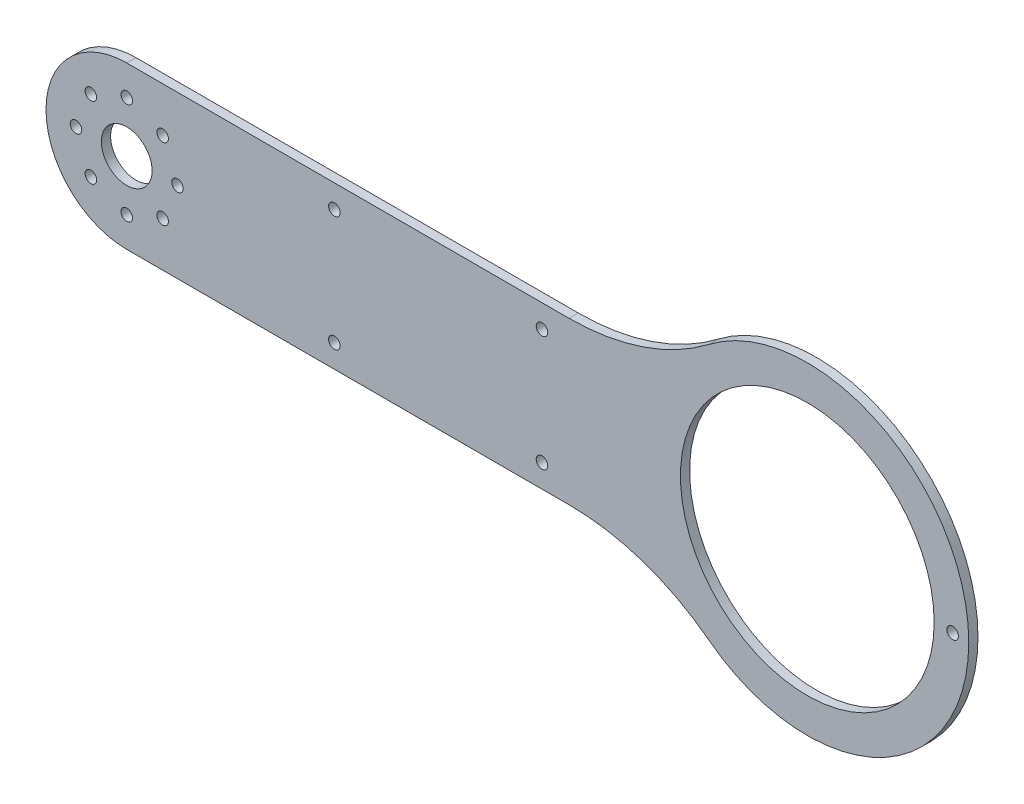
ISO-10303-21;
HEADER;
FILE_DESCRIPTION(('STEP AP214'),'2;1');
FILE_NAME('part.step','',(''),(''),'','','');
FILE_SCHEMA(('AUTOMOTIVE_DESIGN { 1 0 10303 214 1 1 1 1 }'));
ENDSEC;
DATA;
#1=APPLICATION_CONTEXT('core data for automotive mechanical design processes');
#2=APPLICATION_PROTOCOL_DEFINITION('international standard','automotive_design',2000,#1);
#3=PRODUCT_CONTEXT('',#1,'mechanical');
#4=PRODUCT('Part','Part','',(#3));
#5=PRODUCT_RELATED_PRODUCT_CATEGORY('part','',(#4));
#6=PRODUCT_DEFINITION_FORMATION('','',#4);
#7=PRODUCT_DEFINITION_CONTEXT('part definition',#1,'design');
#8=PRODUCT_DEFINITION('design','',#6,#7);
#9=PRODUCT_DEFINITION_SHAPE('','',#8);
#10=(LENGTH_UNIT() NAMED_UNIT(*) SI_UNIT(.MILLI.,.METRE.));
#11=(NAMED_UNIT(*) PLANE_ANGLE_UNIT() SI_UNIT($,.RADIAN.));
#12=(NAMED_UNIT(*) SI_UNIT($,.STERADIAN.) SOLID_ANGLE_UNIT());
#13=UNCERTAINTY_MEASURE_WITH_UNIT(LENGTH_MEASURE(1.E-05),#10,'distance_accuracy_value','');
#14=(GEOMETRIC_REPRESENTATION_CONTEXT(3) GLOBAL_UNCERTAINTY_ASSIGNED_CONTEXT((#13)) GLOBAL_UNIT_ASSIGNED_CONTEXT((#10,
#11,#12)) REPRESENTATION_CONTEXT('',''));
#15=CARTESIAN_POINT('',(0.,0.,0.));
#16=DIRECTION('',(0.,0.,1.));
#17=DIRECTION('',(1.,0.,0.));
#18=AXIS2_PLACEMENT_3D('',#15,#16,#17);
#19=CARTESIAN_POINT('',(-165.,-17.5,2.));
#20=DIRECTION('',(0.,1.,0.));
#21=DIRECTION('',(1.,0.,0.));
#22=AXIS2_PLACEMENT_3D('',#19,#20,#21);
#23=PLANE('',#22);
#24=DIRECTION('',(0.,0.,1.));
#25=VECTOR('',#24,1.);
#26=CARTESIAN_POINT('',(-147.5,-17.5,2.));
#27=LINE('',#26,#25);
#28=CARTESIAN_POINT('',(-147.5,-17.5,0.));
#29=VERTEX_POINT('',#28);
#30=CARTESIAN_POINT('',(-147.5,-17.5,2.));
#31=VERTEX_POINT('',#30);
#32=EDGE_CURVE('E11',#29,#31,#27,.T.);
#33=ORIENTED_EDGE('',*,*,#32,.F.);
#34=DIRECTION('',(-1.,0.,0.));
#35=VECTOR('',#34,1.);
#36=CARTESIAN_POINT('',(-51.6599457994296,-17.5,0.));
#37=LINE('',#36,#35);
#38=CARTESIAN_POINT('',(-51.6599457994295,-17.5,0.));
#39=VERTEX_POINT('',#38);
#40=EDGE_CURVE('E108',#29,#39,#37,.F.);
#41=ORIENTED_EDGE('',*,*,#40,.T.);
#42=DIRECTION('',(0.,0.,1.));
#43=VECTOR('',#42,1.);
#44=CARTESIAN_POINT('',(-51.6599457994295,-17.5,2.));
#45=LINE('',#44,#43);
#46=CARTESIAN_POINT('',(-51.6599457994295,-17.5,2.));
#47=VERTEX_POINT('',#46);
#48=EDGE_CURVE('E51',#39,#47,#45,.T.);
#49=ORIENTED_EDGE('',*,*,#48,.T.);
#50=DIRECTION('',(1.,0.,0.));
#51=VECTOR('',#50,1.);
#52=CARTESIAN_POINT('',(-165.,-17.5,2.));
#53=LINE('',#52,#51);
#54=EDGE_CURVE('E213',#31,#47,#53,.T.);
#55=ORIENTED_EDGE('',*,*,#54,.F.);
#56=EDGE_LOOP('',(#33,#41,#49,#55));
#57=FACE_BOUND('',#56,.T.);
#58=ADVANCED_FACE('F40',(#57),#23,.F.);
#59=CARTESIAN_POINT('',(-51.6599457994295,-67.5,2.));
#60=DIRECTION('',(0.,0.,-1.));
#61=DIRECTION('',(-1.,0.,0.));
#62=AXIS2_PLACEMENT_3D('',#59,#60,#61);
#63=CYLINDRICAL_SURFACE('',#62,50.);
#64=ORIENTED_EDGE('',*,*,#48,.F.);
#65=CARTESIAN_POINT('',(-51.6599457994295,-67.5,0.));
#66=DIRECTION('',(0.,0.,-1.));
#67=DIRECTION('',(-1.,0.,0.));
#68=AXIS2_PLACEMENT_3D('',#65,#66,#67);
#69=CIRCLE('',#68,50.);
#70=CARTESIAN_POINT('',(-21.2717423880004,-27.7941176470588,0.));
#71=VERTEX_POINT('',#70);
#72=EDGE_CURVE('E129',#39,#71,#69,.T.);
#73=ORIENTED_EDGE('',*,*,#72,.T.);
#74=DIRECTION('',(0.,0.,1.));
#75=VECTOR('',#74,1.);
#76=CARTESIAN_POINT('',(-21.2717423880004,-27.7941176470588,2.));
#77=LINE('',#76,#75);
#78=CARTESIAN_POINT('',(-21.2717423880004,-27.7941176470588,2.));
#79=VERTEX_POINT('',#78);
#80=EDGE_CURVE('E204',#71,#79,#77,.T.);
#81=ORIENTED_EDGE('',*,*,#80,.T.);
#82=CARTESIAN_POINT('',(-51.6599457994295,-67.5,2.));
#83=DIRECTION('',(0.,0.,-1.));
#84=DIRECTION('',(-1.,0.,0.));
#85=AXIS2_PLACEMENT_3D('',#82,#83,#84);
#86=CIRCLE('',#85,50.);
#87=EDGE_CURVE('E223',#47,#79,#86,.T.);
#88=ORIENTED_EDGE('',*,*,#87,.F.);
#89=EDGE_LOOP('',(#64,#73,#81,#88));
#90=FACE_BOUND('',#89,.T.);
#91=ADVANCED_FACE('F227',(#90),#63,.F.);
#92=CARTESIAN_POINT('',(0.,0.,2.));
#93=DIRECTION('',(0.,0.,-1.));
#94=DIRECTION('',(-1.,0.,0.));
#95=AXIS2_PLACEMENT_3D('',#92,#93,#94);
#96=CYLINDRICAL_SURFACE('',#95,35.);
#97=ORIENTED_EDGE('',*,*,#80,.F.);
#98=CARTESIAN_POINT('',(0.,0.,0.));
#99=DIRECTION('',(0.,0.,1.));
#100=DIRECTION('',(1.,0.,0.));
#101=AXIS2_PLACEMENT_3D('',#98,#99,#100);
#102=CIRCLE('',#101,35.);
#103=CARTESIAN_POINT('',(-21.2717423880004,27.7941176470588,0.));
#104=VERTEX_POINT('',#103);
#105=EDGE_CURVE('E125',#71,#104,#102,.T.);
#106=ORIENTED_EDGE('',*,*,#105,.T.);
#107=DIRECTION('',(0.,0.,1.));
#108=VECTOR('',#107,1.);
#109=CARTESIAN_POINT('',(-21.2717423880004,27.7941176470588,2.));
#110=LINE('',#109,#108);
#111=CARTESIAN_POINT('',(-21.2717423880004,27.7941176470588,2.));
#112=VERTEX_POINT('',#111);
#113=EDGE_CURVE('E200',#104,#112,#110,.T.);
#114=ORIENTED_EDGE('',*,*,#113,.T.);
#115=CARTESIAN_POINT('',(0.,0.,2.));
#116=DIRECTION('',(0.,0.,1.));
#117=DIRECTION('',(1.,0.,0.));
#118=AXIS2_PLACEMENT_3D('',#115,#116,#117);
#119=CIRCLE('',#118,35.);
#120=EDGE_CURVE('E229',#79,#112,#119,.T.);
#121=ORIENTED_EDGE('',*,*,#120,.F.);
#122=EDGE_LOOP('',(#97,#106,#114,#121));
#123=FACE_BOUND('',#122,.T.);
#124=ADVANCED_FACE('F318',(#123),#96,.T.);
#125=CARTESIAN_POINT('',(-51.6599457994296,67.5,2.));
#126=DIRECTION('',(0.,0.,-1.));
#127=DIRECTION('',(-1.,0.,0.));
#128=AXIS2_PLACEMENT_3D('',#125,#126,#127);
#129=CYLINDRICAL_SURFACE('',#128,50.);
#130=ORIENTED_EDGE('',*,*,#113,.F.);
#131=CARTESIAN_POINT('',(-51.6599457994296,67.5,0.));
#132=DIRECTION('',(0.,0.,-1.));
#133=DIRECTION('',(-1.,0.,0.));
#134=AXIS2_PLACEMENT_3D('',#131,#132,#133);
#135=CIRCLE('',#134,50.);
#136=CARTESIAN_POINT('',(-51.6599457994296,17.5,0.));
#137=VERTEX_POINT('',#136);
#138=EDGE_CURVE('E121',#104,#137,#135,.T.);
#139=ORIENTED_EDGE('',*,*,#138,.T.);
#140=DIRECTION('',(0.,0.,1.));
#141=VECTOR('',#140,1.);
#142=CARTESIAN_POINT('',(-51.6599457994296,17.5,2.));
#143=LINE('',#142,#141);
#144=CARTESIAN_POINT('',(-51.6599457994296,17.5,2.));
#145=VERTEX_POINT('',#144);
#146=EDGE_CURVE('E197',#137,#145,#143,.T.);
#147=ORIENTED_EDGE('',*,*,#146,.T.);
#148=CARTESIAN_POINT('',(-51.6599457994296,67.5,2.));
#149=DIRECTION('',(0.,0.,-1.));
#150=DIRECTION('',(-1.,0.,0.));
#151=AXIS2_PLACEMENT_3D('',#148,#149,#150);
#152=CIRCLE('',#151,50.);
#153=EDGE_CURVE('E232',#112,#145,#152,.T.);
#154=ORIENTED_EDGE('',*,*,#153,.F.);
#155=EDGE_LOOP('',(#130,#139,#147,#154));
#156=FACE_BOUND('',#155,.T.);
#157=ADVANCED_FACE('F426',(#156),#129,.F.);
#158=CARTESIAN_POINT('',(-165.,17.5,2.));
#159=DIRECTION('',(0.,-1.,0.));
#160=DIRECTION('',(-1.,0.,0.));
#161=AXIS2_PLACEMENT_3D('',#158,#159,#160);
#162=PLANE('',#161);
#163=ORIENTED_EDGE('',*,*,#146,.F.);
#164=DIRECTION('',(-1.,0.,0.));
#165=VECTOR('',#164,1.);
#166=CARTESIAN_POINT('',(-51.6599457994296,17.5,0.));
#167=LINE('',#166,#165);
#168=CARTESIAN_POINT('',(-147.5,17.5,0.));
#169=VERTEX_POINT('',#168);
#170=EDGE_CURVE('E117',#137,#169,#167,.T.);
#171=ORIENTED_EDGE('',*,*,#170,.T.);
#172=DIRECTION('',(0.,0.,1.));
#173=VECTOR('',#172,1.);
#174=CARTESIAN_POINT('',(-147.5,17.5,2.));
#175=LINE('',#174,#173);
#176=CARTESIAN_POINT('',(-147.5,17.5,2.));
#177=VERTEX_POINT('',#176);
#178=EDGE_CURVE('E59',#169,#177,#175,.T.);
#179=ORIENTED_EDGE('',*,*,#178,.T.);
#180=DIRECTION('',(-1.,0.,0.));
#181=VECTOR('',#180,1.);
#182=CARTESIAN_POINT('',(-165.,17.5,2.));
#183=LINE('',#182,#181);
#184=EDGE_CURVE('E239',#145,#177,#183,.T.);
#185=ORIENTED_EDGE('',*,*,#184,.F.);
#186=EDGE_LOOP('',(#163,#171,#179,#185));
#187=FACE_BOUND('',#186,.T.);
#188=ADVANCED_FACE('F436',(#187),#162,.F.);
#189=CARTESIAN_POINT('',(-147.5,0.,2.));
#190=DIRECTION('',(0.,0.,-1.));
#191=DIRECTION('',(-1.,0.,0.));
#192=AXIS2_PLACEMENT_3D('',#189,#190,#191);
#193=CYLINDRICAL_SURFACE('',#192,17.5);
#194=ORIENTED_EDGE('',*,*,#178,.F.);
#195=CARTESIAN_POINT('',(-147.5,0.,0.));
#196=DIRECTION('',(0.,0.,-1.));
#197=DIRECTION('',(-1.,0.,0.));
#198=AXIS2_PLACEMENT_3D('',#195,#196,#197);
#199=CIRCLE('',#198,17.5);
#200=CARTESIAN_POINT('',(-165.,0.,0.));
#201=VERTEX_POINT('',#200);
#202=EDGE_CURVE('E106',#169,#201,#199,.F.);
#203=ORIENTED_EDGE('',*,*,#202,.T.);
#204=DIRECTION('',(0.,0.,1.));
#205=VECTOR('',#204,1.);
#206=CARTESIAN_POINT('',(-165.,0.,2.));
#207=LINE('',#206,#205);
#208=CARTESIAN_POINT('',(-165.,0.,2.));
#209=VERTEX_POINT('',#208);
#210=EDGE_CURVE('E44',#201,#209,#207,.T.);
#211=ORIENTED_EDGE('',*,*,#210,.T.);
#212=CARTESIAN_POINT('',(-147.5,0.,2.));
#213=DIRECTION('',(0.,0.,-1.));
#214=DIRECTION('',(-1.,0.,0.));
#215=AXIS2_PLACEMENT_3D('',#212,#213,#214);
#216=CIRCLE('',#215,17.5);
#217=EDGE_CURVE('E194',#177,#209,#216,.F.);
#218=ORIENTED_EDGE('',*,*,#217,.F.);
#219=EDGE_LOOP('',(#194,#203,#211,#218));
#220=FACE_BOUND('',#219,.T.);
#221=ADVANCED_FACE('F111',(#220),#193,.T.);
#222=CARTESIAN_POINT('',(-147.5,0.,2.));
#223=DIRECTION('',(0.,0.,-1.));
#224=DIRECTION('',(-1.,0.,0.));
#225=AXIS2_PLACEMENT_3D('',#222,#223,#224);
#226=CYLINDRICAL_SURFACE('',#225,17.5);
#227=CARTESIAN_POINT('',(-147.5,0.,0.));
#228=DIRECTION('',(0.,0.,-1.));
#229=DIRECTION('',(-1.,0.,0.));
#230=AXIS2_PLACEMENT_3D('',#227,#228,#229);
#231=CIRCLE('',#230,17.5);
#232=EDGE_CURVE('E93',#201,#29,#231,.F.);
#233=ORIENTED_EDGE('',*,*,#232,.T.);
#234=ORIENTED_EDGE('',*,*,#32,.T.);
#235=CARTESIAN_POINT('',(-147.5,0.,2.));
#236=DIRECTION('',(0.,0.,-1.));
#237=DIRECTION('',(-1.,0.,0.));
#238=AXIS2_PLACEMENT_3D('',#235,#236,#237);
#239=CIRCLE('',#238,17.5);
#240=EDGE_CURVE('E95',#209,#31,#239,.F.);
#241=ORIENTED_EDGE('',*,*,#240,.F.);
#242=ORIENTED_EDGE('',*,*,#210,.F.);
#243=EDGE_LOOP('',(#233,#234,#241,#242));
#244=FACE_BOUND('',#243,.T.);
#245=ADVANCED_FACE('F92',(#244),#226,.T.);
#246=CARTESIAN_POINT('',(0.,0.,2.));
#247=DIRECTION('',(0.,0.,-1.));
#248=DIRECTION('',(-1.,0.,0.));
#249=AXIS2_PLACEMENT_3D('',#246,#247,#248);
#250=CYLINDRICAL_SURFACE('',#249,27.5);
#251=CARTESIAN_POINT('',(0.,0.,2.));
#252=DIRECTION('',(0.,0.,1.));
#253=DIRECTION('',(1.,0.,0.));
#254=AXIS2_PLACEMENT_3D('',#251,#252,#253);
#255=CIRCLE('',#254,27.5);
#256=CARTESIAN_POINT('',(27.5,0.,2.));
#257=VERTEX_POINT('',#256);
#258=EDGE_CURVE('E243',#257,#257,#255,.T.);
#259=ORIENTED_EDGE('',*,*,#258,.T.);
#260=EDGE_LOOP('',(#259));
#261=FACE_BOUND('',#260,.T.);
#262=CARTESIAN_POINT('',(0.,0.,0.));
#263=DIRECTION('',(0.,0.,1.));
#264=DIRECTION('',(1.,0.,0.));
#265=AXIS2_PLACEMENT_3D('',#262,#263,#264);
#266=CIRCLE('',#265,27.5);
#267=CARTESIAN_POINT('',(27.5,0.,0.));
#268=VERTEX_POINT('',#267);
#269=EDGE_CURVE('E120',#268,#268,#266,.T.);
#270=ORIENTED_EDGE('',*,*,#269,.F.);
#271=EDGE_LOOP('',(#270));
#272=FACE_BOUND('',#271,.T.);
#273=ADVANCED_FACE('F324',(#261,#272),#250,.F.);
#274=CARTESIAN_POINT('',(-147.5,0.,2.));
#275=DIRECTION('',(0.,0.,-1.));
#276=DIRECTION('',(-1.,0.,0.));
#277=AXIS2_PLACEMENT_3D('',#274,#275,#276);
#278=CYLINDRICAL_SURFACE('',#277,5.50000000000002);
#279=CARTESIAN_POINT('',(-147.5,0.,2.));
#280=DIRECTION('',(0.,0.,1.));
#281=DIRECTION('',(1.,0.,0.));
#282=AXIS2_PLACEMENT_3D('',#279,#280,#281);
#283=CIRCLE('',#282,5.50000000000002);
#284=CARTESIAN_POINT('',(-142.,0.,2.));
#285=VERTEX_POINT('',#284);
#286=EDGE_CURVE('E247',#285,#285,#283,.T.);
#287=ORIENTED_EDGE('',*,*,#286,.T.);
#288=EDGE_LOOP('',(#287));
#289=FACE_BOUND('',#288,.T.);
#290=CARTESIAN_POINT('',(-147.5,0.,0.));
#291=DIRECTION('',(0.,0.,1.));
#292=DIRECTION('',(1.,0.,0.));
#293=AXIS2_PLACEMENT_3D('',#290,#291,#292);
#294=CIRCLE('',#293,5.50000000000002);
#295=CARTESIAN_POINT('',(-142.,0.,0.));
#296=VERTEX_POINT('',#295);
#297=EDGE_CURVE('E138',#296,#296,#294,.T.);
#298=ORIENTED_EDGE('',*,*,#297,.F.);
#299=EDGE_LOOP('',(#298));
#300=FACE_BOUND('',#299,.T.);
#301=ADVANCED_FACE('F327',(#289,#300),#278,.F.);
#302=CARTESIAN_POINT('',(-147.5,11.,2.));
#303=DIRECTION('',(0.,0.,-1.));
#304=DIRECTION('',(-1.,0.,0.));
#305=AXIS2_PLACEMENT_3D('',#302,#303,#304);
#306=CYLINDRICAL_SURFACE('',#305,1.25000000000001);
#307=CARTESIAN_POINT('',(-147.5,11.,2.));
#308=DIRECTION('',(0.,0.,1.));
#309=DIRECTION('',(1.,0.,0.));
#310=AXIS2_PLACEMENT_3D('',#307,#308,#309);
#311=CIRCLE('',#310,1.25000000000001);
#312=CARTESIAN_POINT('',(-146.25,11.,2.));
#313=VERTEX_POINT('',#312);
#314=EDGE_CURVE('E251',#313,#313,#311,.T.);
#315=ORIENTED_EDGE('',*,*,#314,.T.);
#316=EDGE_LOOP('',(#315));
#317=FACE_BOUND('',#316,.T.);
#318=CARTESIAN_POINT('',(-147.5,11.,0.));
#319=DIRECTION('',(0.,0.,1.));
#320=DIRECTION('',(1.,0.,0.));
#321=AXIS2_PLACEMENT_3D('',#318,#319,#320);
#322=CIRCLE('',#321,1.25000000000001);
#323=CARTESIAN_POINT('',(-146.25,11.,0.));
#324=VERTEX_POINT('',#323);
#325=EDGE_CURVE('E142',#324,#324,#322,.T.);
#326=ORIENTED_EDGE('',*,*,#325,.F.);
#327=EDGE_LOOP('',(#326));
#328=FACE_BOUND('',#327,.T.);
#329=ADVANCED_FACE('F331',(#317,#328),#306,.F.);
#330=CARTESIAN_POINT('',(-139.721825406948,7.77817459305199,2.));
#331=DIRECTION('',(0.,0.,-1.));
#332=DIRECTION('',(-1.,0.,0.));
#333=AXIS2_PLACEMENT_3D('',#330,#331,#332);
#334=CYLINDRICAL_SURFACE('',#333,1.25000000000004);
#335=CARTESIAN_POINT('',(-139.721825406948,7.77817459305199,2.));
#336=DIRECTION('',(0.,0.,1.));
#337=DIRECTION('',(1.,0.,0.));
#338=AXIS2_PLACEMENT_3D('',#335,#336,#337);
#339=CIRCLE('',#338,1.25000000000004);
#340=CARTESIAN_POINT('',(-138.471825406948,7.77817459305199,2.));
#341=VERTEX_POINT('',#340);
#342=EDGE_CURVE('E255',#341,#341,#339,.T.);
#343=ORIENTED_EDGE('',*,*,#342,.T.);
#344=EDGE_LOOP('',(#343));
#345=FACE_BOUND('',#344,.T.);
#346=CARTESIAN_POINT('',(-139.721825406948,7.77817459305199,0.));
#347=DIRECTION('',(0.,0.,1.));
#348=DIRECTION('',(1.,0.,0.));
#349=AXIS2_PLACEMENT_3D('',#346,#347,#348);
#350=CIRCLE('',#349,1.25000000000004);
#351=CARTESIAN_POINT('',(-138.471825406948,7.77817459305199,0.));
#352=VERTEX_POINT('',#351);
#353=EDGE_CURVE('E146',#352,#352,#350,.T.);
#354=ORIENTED_EDGE('',*,*,#353,.F.);
#355=EDGE_LOOP('',(#354));
#356=FACE_BOUND('',#355,.T.);
#357=ADVANCED_FACE('F335',(#345,#356),#334,.F.);
#358=CARTESIAN_POINT('',(-136.5,0.,2.));
#359=DIRECTION('',(0.,0.,-1.));
#360=DIRECTION('',(-1.,0.,0.));
#361=AXIS2_PLACEMENT_3D('',#358,#359,#360);
#362=CYLINDRICAL_SURFACE('',#361,1.25000000000001);
#363=CARTESIAN_POINT('',(-136.5,0.,2.));
#364=DIRECTION('',(0.,0.,1.));
#365=DIRECTION('',(1.,0.,0.));
#366=AXIS2_PLACEMENT_3D('',#363,#364,#365);
#367=CIRCLE('',#366,1.25000000000001);
#368=CARTESIAN_POINT('',(-135.25,0.,2.));
#369=VERTEX_POINT('',#368);
#370=EDGE_CURVE('E259',#369,#369,#367,.T.);
#371=ORIENTED_EDGE('',*,*,#370,.T.);
#372=EDGE_LOOP('',(#371));
#373=FACE_BOUND('',#372,.T.);
#374=CARTESIAN_POINT('',(-136.5,0.,0.));
#375=DIRECTION('',(0.,0.,1.));
#376=DIRECTION('',(1.,0.,0.));
#377=AXIS2_PLACEMENT_3D('',#374,#375,#376);
#378=CIRCLE('',#377,1.25000000000001);
#379=CARTESIAN_POINT('',(-135.25,0.,0.));
#380=VERTEX_POINT('',#379);
#381=EDGE_CURVE('E150',#380,#380,#378,.T.);
#382=ORIENTED_EDGE('',*,*,#381,.F.);
#383=EDGE_LOOP('',(#382));
#384=FACE_BOUND('',#383,.T.);
#385=ADVANCED_FACE('F339',(#373,#384),#362,.F.);
#386=CARTESIAN_POINT('',(-139.721825406948,-7.77817459305204,2.));
#387=DIRECTION('',(0.,0.,-1.));
#388=DIRECTION('',(-1.,0.,0.));
#389=AXIS2_PLACEMENT_3D('',#386,#387,#388);
#390=CYLINDRICAL_SURFACE('',#389,1.25000000000001);
#391=CARTESIAN_POINT('',(-139.721825406948,-7.77817459305204,2.));
#392=DIRECTION('',(0.,0.,1.));
#393=DIRECTION('',(1.,0.,0.));
#394=AXIS2_PLACEMENT_3D('',#391,#392,#393);
#395=CIRCLE('',#394,1.25000000000001);
#396=CARTESIAN_POINT('',(-138.471825406948,-7.77817459305204,2.));
#397=VERTEX_POINT('',#396);
#398=EDGE_CURVE('E263',#397,#397,#395,.T.);
#399=ORIENTED_EDGE('',*,*,#398,.T.);
#400=EDGE_LOOP('',(#399));
#401=FACE_BOUND('',#400,.T.);
#402=CARTESIAN_POINT('',(-139.721825406948,-7.77817459305204,0.));
#403=DIRECTION('',(0.,0.,1.));
#404=DIRECTION('',(1.,0.,0.));
#405=AXIS2_PLACEMENT_3D('',#402,#403,#404);
#406=CIRCLE('',#405,1.25000000000001);
#407=CARTESIAN_POINT('',(-138.471825406948,-7.77817459305204,0.));
#408=VERTEX_POINT('',#407);
#409=EDGE_CURVE('E154',#408,#408,#406,.T.);
#410=ORIENTED_EDGE('',*,*,#409,.F.);
#411=EDGE_LOOP('',(#410));
#412=FACE_BOUND('',#411,.T.);
#413=ADVANCED_FACE('F343',(#401,#412),#390,.F.);
#414=CARTESIAN_POINT('',(-147.5,-11.,2.));
#415=DIRECTION('',(0.,0.,-1.));
#416=DIRECTION('',(-1.,0.,0.));
#417=AXIS2_PLACEMENT_3D('',#414,#415,#416);
#418=CYLINDRICAL_SURFACE('',#417,1.25000000000001);
#419=CARTESIAN_POINT('',(-147.5,-11.,2.));
#420=DIRECTION('',(0.,0.,1.));
#421=DIRECTION('',(1.,0.,0.));
#422=AXIS2_PLACEMENT_3D('',#419,#420,#421);
#423=CIRCLE('',#422,1.25000000000001);
#424=CARTESIAN_POINT('',(-146.25,-11.,2.));
#425=VERTEX_POINT('',#424);
#426=EDGE_CURVE('E267',#425,#425,#423,.T.);
#427=ORIENTED_EDGE('',*,*,#426,.T.);
#428=EDGE_LOOP('',(#427));
#429=FACE_BOUND('',#428,.T.);
#430=CARTESIAN_POINT('',(-147.5,-11.,0.));
#431=DIRECTION('',(0.,0.,1.));
#432=DIRECTION('',(1.,0.,0.));
#433=AXIS2_PLACEMENT_3D('',#430,#431,#432);
#434=CIRCLE('',#433,1.25000000000001);
#435=CARTESIAN_POINT('',(-146.25,-11.,0.));
#436=VERTEX_POINT('',#435);
#437=EDGE_CURVE('E158',#436,#436,#434,.T.);
#438=ORIENTED_EDGE('',*,*,#437,.F.);
#439=EDGE_LOOP('',(#438));
#440=FACE_BOUND('',#439,.T.);
#441=ADVANCED_FACE('F347',(#429,#440),#418,.F.);
#442=CARTESIAN_POINT('',(-155.278174593052,-7.77817459305204,2.));
#443=DIRECTION('',(0.,0.,-1.));
#444=DIRECTION('',(-1.,0.,0.));
#445=AXIS2_PLACEMENT_3D('',#442,#443,#444);
#446=CYLINDRICAL_SURFACE('',#445,1.25000000000001);
#447=CARTESIAN_POINT('',(-155.278174593052,-7.77817459305204,2.));
#448=DIRECTION('',(0.,0.,1.));
#449=DIRECTION('',(1.,0.,0.));
#450=AXIS2_PLACEMENT_3D('',#447,#448,#449);
#451=CIRCLE('',#450,1.25000000000001);
#452=CARTESIAN_POINT('',(-154.028174593052,-7.77817459305204,2.));
#453=VERTEX_POINT('',#452);
#454=EDGE_CURVE('E271',#453,#453,#451,.T.);
#455=ORIENTED_EDGE('',*,*,#454,.T.);
#456=EDGE_LOOP('',(#455));
#457=FACE_BOUND('',#456,.T.);
#458=CARTESIAN_POINT('',(-155.278174593052,-7.77817459305204,0.));
#459=DIRECTION('',(0.,0.,1.));
#460=DIRECTION('',(1.,0.,0.));
#461=AXIS2_PLACEMENT_3D('',#458,#459,#460);
#462=CIRCLE('',#461,1.25000000000001);
#463=CARTESIAN_POINT('',(-154.028174593052,-7.77817459305204,0.));
#464=VERTEX_POINT('',#463);
#465=EDGE_CURVE('E162',#464,#464,#462,.T.);
#466=ORIENTED_EDGE('',*,*,#465,.F.);
#467=EDGE_LOOP('',(#466));
#468=FACE_BOUND('',#467,.T.);
#469=ADVANCED_FACE('F351',(#457,#468),#446,.F.);
#470=CARTESIAN_POINT('',(-158.5,0.,2.));
#471=DIRECTION('',(0.,0.,-1.));
#472=DIRECTION('',(-1.,0.,0.));
#473=AXIS2_PLACEMENT_3D('',#470,#471,#472);
#474=CYLINDRICAL_SURFACE('',#473,1.25000000000001);
#475=CARTESIAN_POINT('',(-158.5,0.,2.));
#476=DIRECTION('',(0.,0.,1.));
#477=DIRECTION('',(1.,0.,0.));
#478=AXIS2_PLACEMENT_3D('',#475,#476,#477);
#479=CIRCLE('',#478,1.25000000000001);
#480=CARTESIAN_POINT('',(-157.25,0.,2.));
#481=VERTEX_POINT('',#480);
#482=EDGE_CURVE('E275',#481,#481,#479,.T.);
#483=ORIENTED_EDGE('',*,*,#482,.T.);
#484=EDGE_LOOP('',(#483));
#485=FACE_BOUND('',#484,.T.);
#486=CARTESIAN_POINT('',(-158.5,0.,0.));
#487=DIRECTION('',(0.,0.,1.));
#488=DIRECTION('',(1.,0.,0.));
#489=AXIS2_PLACEMENT_3D('',#486,#487,#488);
#490=CIRCLE('',#489,1.25000000000001);
#491=CARTESIAN_POINT('',(-157.25,0.,0.));
#492=VERTEX_POINT('',#491);
#493=EDGE_CURVE('E166',#492,#492,#490,.T.);
#494=ORIENTED_EDGE('',*,*,#493,.F.);
#495=EDGE_LOOP('',(#494));
#496=FACE_BOUND('',#495,.T.);
#497=ADVANCED_FACE('F355',(#485,#496),#474,.F.);
#498=CARTESIAN_POINT('',(-155.278174593052,7.77817459305201,2.));
#499=DIRECTION('',(0.,0.,-1.));
#500=DIRECTION('',(-1.,0.,0.));
#501=AXIS2_PLACEMENT_3D('',#498,#499,#500);
#502=CYLINDRICAL_SURFACE('',#501,1.25000000000004);
#503=CARTESIAN_POINT('',(-155.278174593052,7.77817459305201,2.));
#504=DIRECTION('',(0.,0.,1.));
#505=DIRECTION('',(1.,0.,0.));
#506=AXIS2_PLACEMENT_3D('',#503,#504,#505);
#507=CIRCLE('',#506,1.25000000000004);
#508=CARTESIAN_POINT('',(-154.028174593052,7.77817459305201,2.));
#509=VERTEX_POINT('',#508);
#510=EDGE_CURVE('E279',#509,#509,#507,.T.);
#511=ORIENTED_EDGE('',*,*,#510,.T.);
#512=EDGE_LOOP('',(#511));
#513=FACE_BOUND('',#512,.T.);
#514=CARTESIAN_POINT('',(-155.278174593052,7.77817459305201,0.));
#515=DIRECTION('',(0.,0.,1.));
#516=DIRECTION('',(1.,0.,0.));
#517=AXIS2_PLACEMENT_3D('',#514,#515,#516);
#518=CIRCLE('',#517,1.25000000000004);
#519=CARTESIAN_POINT('',(-154.028174593052,7.77817459305201,0.));
#520=VERTEX_POINT('',#519);
#521=EDGE_CURVE('E170',#520,#520,#518,.T.);
#522=ORIENTED_EDGE('',*,*,#521,.F.);
#523=EDGE_LOOP('',(#522));
#524=FACE_BOUND('',#523,.T.);
#525=ADVANCED_FACE('F359',(#513,#524),#502,.F.);
#526=CARTESIAN_POINT('',(31.5,0.,2.));
#527=DIRECTION('',(0.,0.,-1.));
#528=DIRECTION('',(-1.,0.,0.));
#529=AXIS2_PLACEMENT_3D('',#526,#527,#528);
#530=CYLINDRICAL_SURFACE('',#529,1.25);
#531=CARTESIAN_POINT('',(31.5,0.,2.));
#532=DIRECTION('',(0.,0.,1.));
#533=DIRECTION('',(1.,0.,0.));
#534=AXIS2_PLACEMENT_3D('',#531,#532,#533);
#535=CIRCLE('',#534,1.25);
#536=CARTESIAN_POINT('',(32.75,0.,2.));
#537=VERTEX_POINT('',#536);
#538=EDGE_CURVE('E283',#537,#537,#535,.T.);
#539=ORIENTED_EDGE('',*,*,#538,.T.);
#540=EDGE_LOOP('',(#539));
#541=FACE_BOUND('',#540,.T.);
#542=CARTESIAN_POINT('',(31.5,0.,0.));
#543=DIRECTION('',(0.,0.,1.));
#544=DIRECTION('',(1.,0.,0.));
#545=AXIS2_PLACEMENT_3D('',#542,#543,#544);
#546=CIRCLE('',#545,1.25);
#547=CARTESIAN_POINT('',(32.75,0.,0.));
#548=VERTEX_POINT('',#547);
#549=EDGE_CURVE('E174',#548,#548,#546,.T.);
#550=ORIENTED_EDGE('',*,*,#549,.F.);
#551=EDGE_LOOP('',(#550));
#552=FACE_BOUND('',#551,.T.);
#553=ADVANCED_FACE('F363',(#541,#552),#530,.F.);
#554=CARTESIAN_POINT('',(-57.5,12.5,2.));
#555=DIRECTION('',(0.,0.,-1.));
#556=DIRECTION('',(-1.,0.,0.));
#557=AXIS2_PLACEMENT_3D('',#554,#555,#556);
#558=CYLINDRICAL_SURFACE('',#557,1.25);
#559=CARTESIAN_POINT('',(-57.5,12.5,2.));
#560=DIRECTION('',(0.,0.,1.));
#561=DIRECTION('',(1.,0.,0.));
#562=AXIS2_PLACEMENT_3D('',#559,#560,#561);
#563=CIRCLE('',#562,1.25);
#564=CARTESIAN_POINT('',(-56.25,12.5,2.));
#565=VERTEX_POINT('',#564);
#566=EDGE_CURVE('E287',#565,#565,#563,.T.);
#567=ORIENTED_EDGE('',*,*,#566,.T.);
#568=EDGE_LOOP('',(#567));
#569=FACE_BOUND('',#568,.T.);
#570=CARTESIAN_POINT('',(-57.5,12.5,0.));
#571=DIRECTION('',(0.,0.,1.));
#572=DIRECTION('',(1.,0.,0.));
#573=AXIS2_PLACEMENT_3D('',#570,#571,#572);
#574=CIRCLE('',#573,1.25);
#575=CARTESIAN_POINT('',(-56.25,12.5,0.));
#576=VERTEX_POINT('',#575);
#577=EDGE_CURVE('E178',#576,#576,#574,.T.);
#578=ORIENTED_EDGE('',*,*,#577,.F.);
#579=EDGE_LOOP('',(#578));
#580=FACE_BOUND('',#579,.T.);
#581=ADVANCED_FACE('F367',(#569,#580),#558,.F.);
#582=CARTESIAN_POINT('',(-102.5,12.5,2.));
#583=DIRECTION('',(0.,0.,-1.));
#584=DIRECTION('',(-1.,0.,0.));
#585=AXIS2_PLACEMENT_3D('',#582,#583,#584);
#586=CYLINDRICAL_SURFACE('',#585,1.25);
#587=CARTESIAN_POINT('',(-102.5,12.5,2.));
#588=DIRECTION('',(0.,0.,1.));
#589=DIRECTION('',(1.,0.,0.));
#590=AXIS2_PLACEMENT_3D('',#587,#588,#589);
#591=CIRCLE('',#590,1.25);
#592=CARTESIAN_POINT('',(-101.25,12.5,2.));
#593=VERTEX_POINT('',#592);
#594=EDGE_CURVE('E291',#593,#593,#591,.T.);
#595=ORIENTED_EDGE('',*,*,#594,.T.);
#596=EDGE_LOOP('',(#595));
#597=FACE_BOUND('',#596,.T.);
#598=CARTESIAN_POINT('',(-102.5,12.5,0.));
#599=DIRECTION('',(0.,0.,1.));
#600=DIRECTION('',(1.,0.,0.));
#601=AXIS2_PLACEMENT_3D('',#598,#599,#600);
#602=CIRCLE('',#601,1.25);
#603=CARTESIAN_POINT('',(-101.25,12.5,0.));
#604=VERTEX_POINT('',#603);
#605=EDGE_CURVE('E182',#604,#604,#602,.T.);
#606=ORIENTED_EDGE('',*,*,#605,.F.);
#607=EDGE_LOOP('',(#606));
#608=FACE_BOUND('',#607,.T.);
#609=ADVANCED_FACE('F371',(#597,#608),#586,.F.);
#610=CARTESIAN_POINT('',(-57.5,-12.5,2.));
#611=DIRECTION('',(0.,0.,-1.));
#612=DIRECTION('',(-1.,0.,0.));
#613=AXIS2_PLACEMENT_3D('',#610,#611,#612);
#614=CYLINDRICAL_SURFACE('',#613,1.25);
#615=CARTESIAN_POINT('',(-57.5,-12.5,2.));
#616=DIRECTION('',(0.,0.,1.));
#617=DIRECTION('',(1.,0.,0.));
#618=AXIS2_PLACEMENT_3D('',#615,#616,#617);
#619=CIRCLE('',#618,1.25);
#620=CARTESIAN_POINT('',(-56.25,-12.5,2.));
#621=VERTEX_POINT('',#620);
#622=EDGE_CURVE('E294',#621,#621,#619,.T.);
#623=ORIENTED_EDGE('',*,*,#622,.T.);
#624=EDGE_LOOP('',(#623));
#625=FACE_BOUND('',#624,.T.);
#626=CARTESIAN_POINT('',(-57.5,-12.5,0.));
#627=DIRECTION('',(0.,0.,1.));
#628=DIRECTION('',(1.,0.,0.));
#629=AXIS2_PLACEMENT_3D('',#626,#627,#628);
#630=CIRCLE('',#629,1.25);
#631=CARTESIAN_POINT('',(-56.25,-12.5,0.));
#632=VERTEX_POINT('',#631);
#633=EDGE_CURVE('E186',#632,#632,#630,.T.);
#634=ORIENTED_EDGE('',*,*,#633,.F.);
#635=EDGE_LOOP('',(#634));
#636=FACE_BOUND('',#635,.T.);
#637=ADVANCED_FACE('F312',(#625,#636),#614,.F.);
#638=CARTESIAN_POINT('',(-102.5,-12.5,2.));
#639=DIRECTION('',(0.,0.,-1.));
#640=DIRECTION('',(-1.,0.,0.));
#641=AXIS2_PLACEMENT_3D('',#638,#639,#640);
#642=CYLINDRICAL_SURFACE('',#641,1.25);
#643=CARTESIAN_POINT('',(-102.5,-12.5,2.));
#644=DIRECTION('',(0.,0.,1.));
#645=DIRECTION('',(1.,0.,0.));
#646=AXIS2_PLACEMENT_3D('',#643,#644,#645);
#647=CIRCLE('',#646,1.25);
#648=CARTESIAN_POINT('',(-101.25,-12.5,2.));
#649=VERTEX_POINT('',#648);
#650=EDGE_CURVE('E100',#649,#649,#647,.T.);
#651=ORIENTED_EDGE('',*,*,#650,.T.);
#652=EDGE_LOOP('',(#651));
#653=FACE_BOUND('',#652,.T.);
#654=CARTESIAN_POINT('',(-102.5,-12.5,0.));
#655=DIRECTION('',(0.,0.,1.));
#656=DIRECTION('',(1.,0.,0.));
#657=AXIS2_PLACEMENT_3D('',#654,#655,#656);
#658=CIRCLE('',#657,1.25);
#659=CARTESIAN_POINT('',(-101.25,-12.5,0.));
#660=VERTEX_POINT('',#659);
#661=EDGE_CURVE('E190',#660,#660,#658,.T.);
#662=ORIENTED_EDGE('',*,*,#661,.F.);
#663=EDGE_LOOP('',(#662));
#664=FACE_BOUND('',#663,.T.);
#665=ADVANCED_FACE('F42',(#653,#664),#642,.F.);
#666=CARTESIAN_POINT('',(-51.6599457994296,67.5,2.));
#667=DIRECTION('',(0.,0.,-1.));
#668=DIRECTION('',(-1.,0.,0.));
#669=AXIS2_PLACEMENT_3D('',#666,#667,#668);
#670=PLANE('',#669);
#671=ORIENTED_EDGE('',*,*,#217,.T.);
#672=ORIENTED_EDGE('',*,*,#240,.T.);
#673=ORIENTED_EDGE('',*,*,#54,.T.);
#674=ORIENTED_EDGE('',*,*,#87,.T.);
#675=ORIENTED_EDGE('',*,*,#120,.T.);
#676=ORIENTED_EDGE('',*,*,#153,.T.);
#677=ORIENTED_EDGE('',*,*,#184,.T.);
#678=EDGE_LOOP('',(#671,#672,#673,#674,#675,#676,#677));
#679=FACE_BOUND('',#678,.T.);
#680=ORIENTED_EDGE('',*,*,#258,.F.);
#681=EDGE_LOOP('',(#680));
#682=FACE_BOUND('',#681,.T.);
#683=ORIENTED_EDGE('',*,*,#286,.F.);
#684=EDGE_LOOP('',(#683));
#685=FACE_BOUND('',#684,.T.);
#686=ORIENTED_EDGE('',*,*,#314,.F.);
#687=EDGE_LOOP('',(#686));
#688=FACE_BOUND('',#687,.T.);
#689=ORIENTED_EDGE('',*,*,#342,.F.);
#690=EDGE_LOOP('',(#689));
#691=FACE_BOUND('',#690,.T.);
#692=ORIENTED_EDGE('',*,*,#370,.F.);
#693=EDGE_LOOP('',(#692));
#694=FACE_BOUND('',#693,.T.);
#695=ORIENTED_EDGE('',*,*,#398,.F.);
#696=EDGE_LOOP('',(#695));
#697=FACE_BOUND('',#696,.T.);
#698=ORIENTED_EDGE('',*,*,#426,.F.);
#699=EDGE_LOOP('',(#698));
#700=FACE_BOUND('',#699,.T.);
#701=ORIENTED_EDGE('',*,*,#454,.F.);
#702=EDGE_LOOP('',(#701));
#703=FACE_BOUND('',#702,.T.);
#704=ORIENTED_EDGE('',*,*,#482,.F.);
#705=EDGE_LOOP('',(#704));
#706=FACE_BOUND('',#705,.T.);
#707=ORIENTED_EDGE('',*,*,#510,.F.);
#708=EDGE_LOOP('',(#707));
#709=FACE_BOUND('',#708,.T.);
#710=ORIENTED_EDGE('',*,*,#538,.F.);
#711=EDGE_LOOP('',(#710));
#712=FACE_BOUND('',#711,.T.);
#713=ORIENTED_EDGE('',*,*,#566,.F.);
#714=EDGE_LOOP('',(#713));
#715=FACE_BOUND('',#714,.T.);
#716=ORIENTED_EDGE('',*,*,#594,.F.);
#717=EDGE_LOOP('',(#716));
#718=FACE_BOUND('',#717,.T.);
#719=ORIENTED_EDGE('',*,*,#622,.F.);
#720=EDGE_LOOP('',(#719));
#721=FACE_BOUND('',#720,.T.);
#722=ORIENTED_EDGE('',*,*,#650,.F.);
#723=EDGE_LOOP('',(#722));
#724=FACE_BOUND('',#723,.T.);
#725=ADVANCED_FACE('F220',(#679,#682,#685,#688,#691,#694,#697,#700,#703,#706,#709,#712,#715,
#718,#721,#724),#670,.F.);
#726=CARTESIAN_POINT('',(-51.6599457994296,67.5,0.));
#727=DIRECTION('',(0.,0.,-1.));
#728=DIRECTION('',(-1.,0.,0.));
#729=AXIS2_PLACEMENT_3D('',#726,#727,#728);
#730=PLANE('',#729);
#731=ORIENTED_EDGE('',*,*,#202,.F.);
#732=ORIENTED_EDGE('',*,*,#170,.F.);
#733=ORIENTED_EDGE('',*,*,#138,.F.);
#734=ORIENTED_EDGE('',*,*,#105,.F.);
#735=ORIENTED_EDGE('',*,*,#72,.F.);
#736=ORIENTED_EDGE('',*,*,#40,.F.);
#737=ORIENTED_EDGE('',*,*,#232,.F.);
#738=EDGE_LOOP('',(#731,#732,#733,#734,#735,#736,#737));
#739=FACE_BOUND('',#738,.T.);
#740=ORIENTED_EDGE('',*,*,#269,.T.);
#741=EDGE_LOOP('',(#740));
#742=FACE_BOUND('',#741,.T.);
#743=ORIENTED_EDGE('',*,*,#297,.T.);
#744=EDGE_LOOP('',(#743));
#745=FACE_BOUND('',#744,.T.);
#746=ORIENTED_EDGE('',*,*,#325,.T.);
#747=EDGE_LOOP('',(#746));
#748=FACE_BOUND('',#747,.T.);
#749=ORIENTED_EDGE('',*,*,#353,.T.);
#750=EDGE_LOOP('',(#749));
#751=FACE_BOUND('',#750,.T.);
#752=ORIENTED_EDGE('',*,*,#381,.T.);
#753=EDGE_LOOP('',(#752));
#754=FACE_BOUND('',#753,.T.);
#755=ORIENTED_EDGE('',*,*,#409,.T.);
#756=EDGE_LOOP('',(#755));
#757=FACE_BOUND('',#756,.T.);
#758=ORIENTED_EDGE('',*,*,#437,.T.);
#759=EDGE_LOOP('',(#758));
#760=FACE_BOUND('',#759,.T.);
#761=ORIENTED_EDGE('',*,*,#465,.T.);
#762=EDGE_LOOP('',(#761));
#763=FACE_BOUND('',#762,.T.);
#764=ORIENTED_EDGE('',*,*,#493,.T.);
#765=EDGE_LOOP('',(#764));
#766=FACE_BOUND('',#765,.T.);
#767=ORIENTED_EDGE('',*,*,#521,.T.);
#768=EDGE_LOOP('',(#767));
#769=FACE_BOUND('',#768,.T.);
#770=ORIENTED_EDGE('',*,*,#549,.T.);
#771=EDGE_LOOP('',(#770));
#772=FACE_BOUND('',#771,.T.);
#773=ORIENTED_EDGE('',*,*,#577,.T.);
#774=EDGE_LOOP('',(#773));
#775=FACE_BOUND('',#774,.T.);
#776=ORIENTED_EDGE('',*,*,#605,.T.);
#777=EDGE_LOOP('',(#776));
#778=FACE_BOUND('',#777,.T.);
#779=ORIENTED_EDGE('',*,*,#633,.T.);
#780=EDGE_LOOP('',(#779));
#781=FACE_BOUND('',#780,.T.);
#782=ORIENTED_EDGE('',*,*,#661,.T.);
#783=EDGE_LOOP('',(#782));
#784=FACE_BOUND('',#783,.T.);
#785=ADVANCED_FACE('F103',(#739,#742,#745,#748,#751,#754,#757,#760,#763,#766,#769,#772,#775,
#778,#781,#784),#730,.T.);
#786=CLOSED_SHELL('',(#58,#91,#124,#157,#188,#221,#245,#273,#301,#329,#357,#385,#413,#441,#469,
#497,#525,#553,#581,#609,#637,#665,#725,#785));
#787=MANIFOLD_SOLID_BREP('B2',#786);
#788=ADVANCED_BREP_SHAPE_REPRESENTATION('',(#18,#787),#14);
#789=SHAPE_DEFINITION_REPRESENTATION(#9,#788);
ENDSEC;
END-ISO-10303-21;
